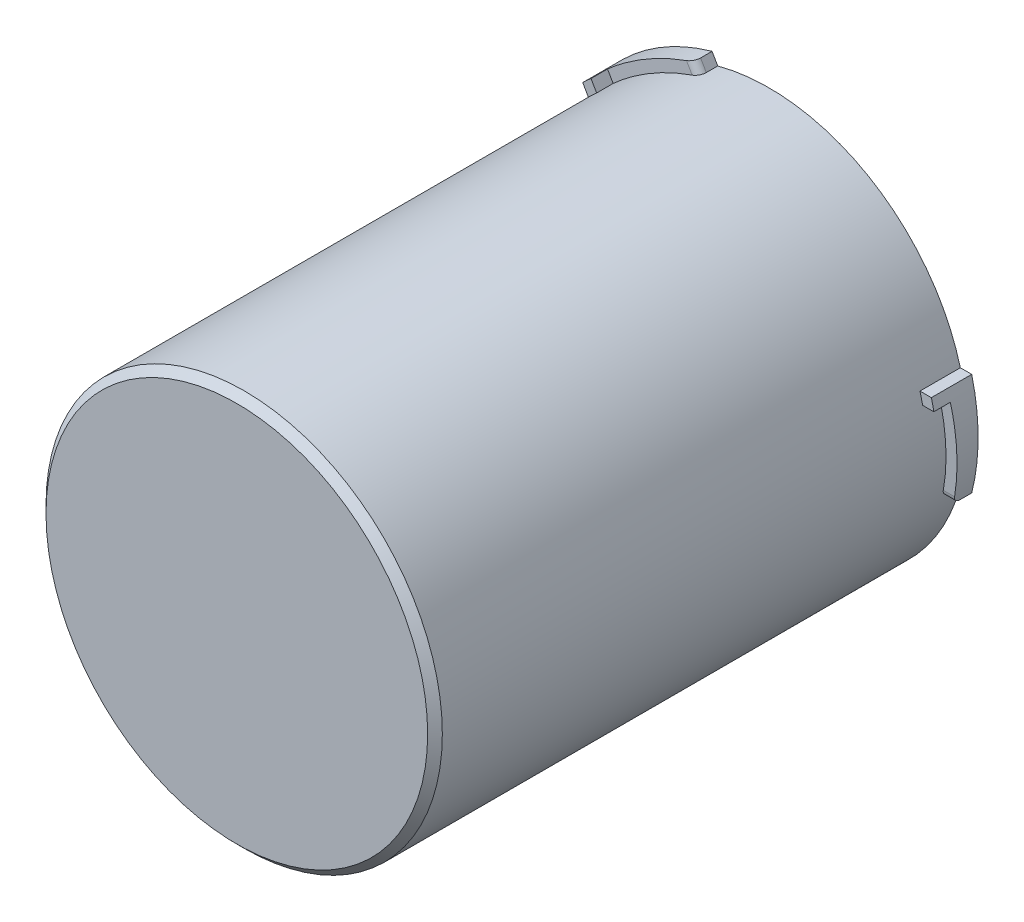
ISO-10303-21;
HEADER;
FILE_DESCRIPTION(('STEP AP214'),'2;1');
FILE_NAME('part.step','',(''),(''),'','','');
FILE_SCHEMA(('AUTOMOTIVE_DESIGN { 1 0 10303 214 1 1 1 1 }'));
ENDSEC;
DATA;
#1=APPLICATION_CONTEXT('core data for automotive mechanical design processes');
#2=APPLICATION_PROTOCOL_DEFINITION('international standard','automotive_design',2000,#1);
#3=PRODUCT_CONTEXT('',#1,'mechanical');
#4=PRODUCT('Part','Part','',(#3));
#5=PRODUCT_RELATED_PRODUCT_CATEGORY('part','',(#4));
#6=PRODUCT_DEFINITION_FORMATION('','',#4);
#7=PRODUCT_DEFINITION_CONTEXT('part definition',#1,'design');
#8=PRODUCT_DEFINITION('design','',#6,#7);
#9=PRODUCT_DEFINITION_SHAPE('','',#8);
#10=(LENGTH_UNIT() NAMED_UNIT(*) SI_UNIT(.MILLI.,.METRE.));
#11=(NAMED_UNIT(*) PLANE_ANGLE_UNIT() SI_UNIT($,.RADIAN.));
#12=(NAMED_UNIT(*) SI_UNIT($,.STERADIAN.) SOLID_ANGLE_UNIT());
#13=UNCERTAINTY_MEASURE_WITH_UNIT(LENGTH_MEASURE(1.E-05),#10,'distance_accuracy_value','');
#14=(GEOMETRIC_REPRESENTATION_CONTEXT(3) GLOBAL_UNCERTAINTY_ASSIGNED_CONTEXT((#13)) GLOBAL_UNIT_ASSIGNED_CONTEXT((#10,
#11,#12)) REPRESENTATION_CONTEXT('',''));
#15=CARTESIAN_POINT('',(0.,0.,0.));
#16=DIRECTION('',(0.,0.,1.));
#17=DIRECTION('',(1.,0.,0.));
#18=AXIS2_PLACEMENT_3D('',#15,#16,#17);
#19=CARTESIAN_POINT('',(-54.,0.,-145.));
#20=DIRECTION('',(0.,0.,-1.));
#21=DIRECTION('',(-1.,0.,0.));
#22=AXIS2_PLACEMENT_3D('',#19,#20,#21);
#23=PLANE('',#22);
#24=CARTESIAN_POINT('',(0.,0.,-145.));
#25=DIRECTION('',(0.,0.,-1.));
#26=DIRECTION('',(-1.,0.,0.));
#27=AXIS2_PLACEMENT_3D('',#24,#25,#26);
#28=CIRCLE('',#27,51.);
#29=CARTESIAN_POINT('',(-51.,0.,-145.));
#30=VERTEX_POINT('',#29);
#31=EDGE_CURVE('E295',#30,#30,#28,.T.);
#32=ORIENTED_EDGE('',*,*,#31,.F.);
#33=EDGE_LOOP('',(#32));
#34=FACE_BOUND('',#33,.T.);
#35=DIRECTION('',(-0.499999999999992,0.866025403784443,0.));
#36=VECTOR('',#35,1.);
#37=CARTESIAN_POINT('',(-35.6243556529818,33.7031939778689,-145.));
#38=LINE('',#37,#36);
#39=CARTESIAN_POINT('',(-38.2011652737924,38.1663591625452,-145.));
#40=VERTEX_POINT('',#39);
#41=CARTESIAN_POINT('',(-39.7513352200644,40.8513322698547,-145.));
#42=VERTEX_POINT('',#41);
#43=EDGE_CURVE('E200',#40,#42,#38,.T.);
#44=ORIENTED_EDGE('',*,*,#43,.T.);
#45=CARTESIAN_POINT('',(0.,0.,-145.));
#46=DIRECTION('',(0.,0.,-1.));
#47=DIRECTION('',(-1.,0.,0.));
#48=AXIS2_PLACEMENT_3D('',#45,#46,#47);
#49=CIRCLE('',#48,57.);
#50=CARTESIAN_POINT('',(-15.5026239141,54.8513322698545,-145.));
#51=VERTEX_POINT('',#50);
#52=EDGE_CURVE('E181',#42,#51,#49,.T.);
#53=ORIENTED_EDGE('',*,*,#52,.T.);
#54=DIRECTION('',(-0.499999999999992,0.866025403784443,0.));
#55=VECTOR('',#54,1.);
#56=CARTESIAN_POINT('',(-11.3756443470174,47.7031939778687,-145.));
#57=LINE('',#56,#55);
#58=CARTESIAN_POINT('',(-13.952453967828,52.166359162545,-145.));
#59=VERTEX_POINT('',#58);
#60=EDGE_CURVE('E211',#59,#51,#57,.T.);
#61=ORIENTED_EDGE('',*,*,#60,.F.);
#62=CARTESIAN_POINT('',(0.,0.,-145.));
#63=DIRECTION('',(0.,0.,-1.));
#64=DIRECTION('',(-1.,0.,0.));
#65=AXIS2_PLACEMENT_3D('',#62,#63,#64);
#66=CIRCLE('',#65,54.);
#67=CARTESIAN_POINT('',(52.1536192416212,14.,-145.));
#68=VERTEX_POINT('',#67);
#69=EDGE_CURVE('E298',#59,#68,#66,.T.);
#70=ORIENTED_EDGE('',*,*,#69,.T.);
#71=DIRECTION('',(1.,0.,0.));
#72=VECTOR('',#71,1.);
#73=CARTESIAN_POINT('',(47.,14.,-145.));
#74=LINE('',#73,#72);
#75=CARTESIAN_POINT('',(55.2539591341652,14.,-145.));
#76=VERTEX_POINT('',#75);
#77=EDGE_CURVE('E267',#68,#76,#74,.T.);
#78=ORIENTED_EDGE('',*,*,#77,.T.);
#79=CARTESIAN_POINT('',(55.2539591341652,-14.,-145.));
#80=VERTEX_POINT('',#79);
#81=EDGE_CURVE('E192',#76,#80,#49,.T.);
#82=ORIENTED_EDGE('',*,*,#81,.T.);
#83=DIRECTION('',(1.,0.,0.));
#84=VECTOR('',#83,1.);
#85=CARTESIAN_POINT('',(47.,-14.,-145.));
#86=LINE('',#85,#84);
#87=CARTESIAN_POINT('',(52.1536192416212,-14.,-145.));
#88=VERTEX_POINT('',#87);
#89=EDGE_CURVE('E271',#88,#80,#86,.T.);
#90=ORIENTED_EDGE('',*,*,#89,.F.);
#91=CARTESIAN_POINT('',(-13.9524539678287,-52.1663591625448,-145.));
#92=VERTEX_POINT('',#91);
#93=EDGE_CURVE('E299',#88,#92,#66,.T.);
#94=ORIENTED_EDGE('',*,*,#93,.T.);
#95=DIRECTION('',(-0.500000000000004,-0.866025403784436,0.));
#96=VECTOR('',#95,1.);
#97=CARTESIAN_POINT('',(-11.3756443470181,-47.7031939778686,-145.));
#98=LINE('',#97,#96);
#99=CARTESIAN_POINT('',(-15.5026239141007,-54.8513322698542,-145.));
#100=VERTEX_POINT('',#99);
#101=EDGE_CURVE('E238',#92,#100,#98,.T.);
#102=ORIENTED_EDGE('',*,*,#101,.T.);
#103=CARTESIAN_POINT('',(-39.7513352200649,-40.8513322698541,-145.));
#104=VERTEX_POINT('',#103);
#105=EDGE_CURVE('E194',#100,#104,#49,.T.);
#106=ORIENTED_EDGE('',*,*,#105,.T.);
#107=DIRECTION('',(-0.500000000000004,-0.866025403784436,0.));
#108=VECTOR('',#107,1.);
#109=CARTESIAN_POINT('',(-35.6243556529823,-33.7031939778685,-145.));
#110=LINE('',#109,#108);
#111=CARTESIAN_POINT('',(-38.2011652737929,-38.1663591625447,-145.));
#112=VERTEX_POINT('',#111);
#113=EDGE_CURVE('E242',#112,#104,#110,.T.);
#114=ORIENTED_EDGE('',*,*,#113,.F.);
#115=EDGE_CURVE('E209',#112,#40,#66,.T.);
#116=ORIENTED_EDGE('',*,*,#115,.T.);
#117=EDGE_LOOP('',(#44,#53,#61,#70,#78,#82,#90,#94,#102,#106,#114,#116));
#118=FACE_BOUND('',#117,.T.);
#119=ADVANCED_FACE('F39',(#34,#118),#23,.T.);
#120=CARTESIAN_POINT('',(47.,14.,-134.));
#121=DIRECTION('',(0.,1.,0.));
#122=DIRECTION('',(0.,0.,1.));
#123=AXIS2_PLACEMENT_3D('',#120,#121,#122);
#124=PLANE('',#123);
#125=DIRECTION('',(1.,0.,0.));
#126=VECTOR('',#125,1.);
#127=CARTESIAN_POINT('',(47.,14.,-134.));
#128=LINE('',#127,#126);
#129=CARTESIAN_POINT('',(52.1536192416212,14.,-134.));
#130=VERTEX_POINT('',#129);
#131=CARTESIAN_POINT('',(55.2539591341652,14.,-134.));
#132=VERTEX_POINT('',#131);
#133=EDGE_CURVE('E266',#130,#132,#128,.T.);
#134=ORIENTED_EDGE('',*,*,#133,.T.);
#135=DIRECTION('',(0.,0.,-1.));
#136=VECTOR('',#135,1.);
#137=CARTESIAN_POINT('',(55.2539591341652,14.,-130.));
#138=LINE('',#137,#136);
#139=EDGE_CURVE('E219',#132,#76,#138,.T.);
#140=ORIENTED_EDGE('',*,*,#139,.T.);
#141=ORIENTED_EDGE('',*,*,#77,.F.);
#142=DIRECTION('',(0.,0.,-1.));
#143=VECTOR('',#142,1.);
#144=CARTESIAN_POINT('',(52.1536192416212,14.,-2.99999999999999));
#145=LINE('',#144,#143);
#146=EDGE_CURVE('E292',#68,#130,#145,.F.);
#147=ORIENTED_EDGE('',*,*,#146,.T.);
#148=EDGE_LOOP('',(#134,#140,#141,#147));
#149=FACE_BOUND('',#148,.T.);
#150=ADVANCED_FACE('F410',(#149),#124,.T.);
#151=CARTESIAN_POINT('',(47.,-14.,-145.));
#152=DIRECTION('',(0.,-1.,0.));
#153=DIRECTION('',(0.,0.,-1.));
#154=AXIS2_PLACEMENT_3D('',#151,#152,#153);
#155=PLANE('',#154);
#156=ORIENTED_EDGE('',*,*,#89,.T.);
#157=DIRECTION('',(0.,0.,-1.));
#158=VECTOR('',#157,1.);
#159=CARTESIAN_POINT('',(55.2539591341652,-14.,-130.));
#160=LINE('',#159,#158);
#161=CARTESIAN_POINT('',(55.2539591341652,-14.,-141.883596765819));
#162=VERTEX_POINT('',#161);
#163=EDGE_CURVE('E388',#80,#162,#160,.F.);
#164=ORIENTED_EDGE('',*,*,#163,.T.);
#165=DIRECTION('',(1.,0.,0.));
#166=VECTOR('',#165,1.);
#167=CARTESIAN_POINT('',(47.,-14.,-141.883596765819));
#168=LINE('',#167,#166);
#169=CARTESIAN_POINT('',(52.1536192416212,-14.,-141.883596765819));
#170=VERTEX_POINT('',#169);
#171=EDGE_CURVE('E305',#162,#170,#168,.F.);
#172=ORIENTED_EDGE('',*,*,#171,.T.);
#173=DIRECTION('',(0.,0.,-1.));
#174=VECTOR('',#173,1.);
#175=CARTESIAN_POINT('',(52.1536192416212,-14.,-2.99999999999999));
#176=LINE('',#175,#174);
#177=EDGE_CURVE('E290',#170,#88,#176,.T.);
#178=ORIENTED_EDGE('',*,*,#177,.T.);
#179=EDGE_LOOP('',(#156,#164,#172,#178));
#180=FACE_BOUND('',#179,.T.);
#181=ADVANCED_FACE('F484',(#180),#155,.T.);
#182=CARTESIAN_POINT('',(47.,-14.,-140.));
#183=DIRECTION('',(0.,-0.0598922907279468,0.998204845465779));
#184=DIRECTION('',(0.,-0.998204845465779,-0.0598922907279468));
#185=AXIS2_PLACEMENT_3D('',#182,#183,#184);
#186=PLANE('',#185);
#187=DIRECTION('',(1.,0.,0.));
#188=VECTOR('',#187,1.);
#189=CARTESIAN_POINT('',(47.,-12.1197845814559,-139.887187074887));
#190=LINE('',#189,#188);
#191=CARTESIAN_POINT('',(52.6223414691812,-12.1197845814559,-139.887187074887));
#192=VERTEX_POINT('',#191);
#193=CARTESIAN_POINT('',(55.6965961410489,-12.1197845814559,-139.887187074887));
#194=VERTEX_POINT('',#193);
#195=EDGE_CURVE('E302',#192,#194,#190,.T.);
#196=ORIENTED_EDGE('',*,*,#195,.T.);
#197=CARTESIAN_POINT('',(0.,0.,-139.16));
#198=DIRECTION('',(0.,-0.0598922907279468,0.998204845465779));
#199=DIRECTION('',(0.,-0.998204845465779,-0.0598922907279468));
#200=AXIS2_PLACEMENT_3D('',#197,#198,#199);
#201=ELLIPSE('',#200,57.102507825839,57.);
#202=CARTESIAN_POINT('',(55.9285258164383,11.,-138.5));
#203=VERTEX_POINT('',#202);
#204=EDGE_CURVE('E54',#194,#203,#201,.T.);
#205=ORIENTED_EDGE('',*,*,#204,.T.);
#206=DIRECTION('',(1.,0.,0.));
#207=VECTOR('',#206,1.);
#208=CARTESIAN_POINT('',(47.,11.,-138.5));
#209=LINE('',#208,#207);
#210=CARTESIAN_POINT('',(52.8677595515452,10.9999999999999,-138.5));
#211=VERTEX_POINT('',#210);
#212=EDGE_CURVE('E274',#211,#203,#209,.T.);
#213=ORIENTED_EDGE('',*,*,#212,.F.);
#214=CARTESIAN_POINT('',(0.,0.,-139.16));
#215=DIRECTION('',(0.,-0.0598922907279468,0.998204845465779));
#216=DIRECTION('',(0.,-0.998204845465779,-0.0598922907279468));
#217=AXIS2_PLACEMENT_3D('',#214,#215,#216);
#218=ELLIPSE('',#217,54.0971126771106,54.);
#219=EDGE_CURVE('E287',#211,#192,#218,.F.);
#220=ORIENTED_EDGE('',*,*,#219,.T.);
#221=EDGE_LOOP('',(#196,#205,#213,#220));
#222=FACE_BOUND('',#221,.T.);
#223=ADVANCED_FACE('F501',(#222),#186,.T.);
#224=CARTESIAN_POINT('',(47.,11.,-138.5));
#225=DIRECTION('',(0.,-1.,0.));
#226=DIRECTION('',(0.,0.,-1.));
#227=AXIS2_PLACEMENT_3D('',#224,#225,#226);
#228=PLANE('',#227);
#229=ORIENTED_EDGE('',*,*,#212,.T.);
#230=DIRECTION('',(0.,0.,-1.));
#231=VECTOR('',#230,1.);
#232=CARTESIAN_POINT('',(55.9285258164383,11.,-130.));
#233=LINE('',#232,#231);
#234=CARTESIAN_POINT('',(55.9285258164383,11.,-134.));
#235=VERTEX_POINT('',#234);
#236=EDGE_CURVE('E392',#203,#235,#233,.F.);
#237=ORIENTED_EDGE('',*,*,#236,.T.);
#238=DIRECTION('',(1.,0.,0.));
#239=VECTOR('',#238,1.);
#240=CARTESIAN_POINT('',(47.,11.,-134.));
#241=LINE('',#240,#239);
#242=CARTESIAN_POINT('',(52.8677595515452,11.,-134.));
#243=VERTEX_POINT('',#242);
#244=EDGE_CURVE('E277',#243,#235,#241,.T.);
#245=ORIENTED_EDGE('',*,*,#244,.F.);
#246=DIRECTION('',(0.,0.,-1.));
#247=VECTOR('',#246,1.);
#248=CARTESIAN_POINT('',(52.8677595515452,10.9999999999999,-2.99999999999999));
#249=LINE('',#248,#247);
#250=EDGE_CURVE('E284',#243,#211,#249,.T.);
#251=ORIENTED_EDGE('',*,*,#250,.T.);
#252=EDGE_LOOP('',(#229,#237,#245,#251));
#253=FACE_BOUND('',#252,.T.);
#254=ADVANCED_FACE('F400',(#253),#228,.T.);
#255=CARTESIAN_POINT('',(47.,11.,-134.));
#256=DIRECTION('',(0.,0.,1.));
#257=DIRECTION('',(1.,0.,0.));
#258=AXIS2_PLACEMENT_3D('',#255,#256,#257);
#259=PLANE('',#258);
#260=ORIENTED_EDGE('',*,*,#244,.T.);
#261=CARTESIAN_POINT('',(0.,0.,-134.));
#262=DIRECTION('',(0.,0.,1.));
#263=DIRECTION('',(1.,0.,0.));
#264=AXIS2_PLACEMENT_3D('',#261,#262,#263);
#265=CIRCLE('',#264,57.);
#266=EDGE_CURVE('E395',#235,#132,#265,.T.);
#267=ORIENTED_EDGE('',*,*,#266,.T.);
#268=ORIENTED_EDGE('',*,*,#133,.F.);
#269=CARTESIAN_POINT('',(0.,0.,-134.));
#270=DIRECTION('',(0.,0.,1.));
#271=DIRECTION('',(1.,0.,0.));
#272=AXIS2_PLACEMENT_3D('',#269,#270,#271);
#273=CIRCLE('',#272,54.);
#274=EDGE_CURVE('E270',#130,#243,#273,.F.);
#275=ORIENTED_EDGE('',*,*,#274,.T.);
#276=EDGE_LOOP('',(#260,#267,#268,#275));
#277=FACE_BOUND('',#276,.T.);
#278=ADVANCED_FACE('F403',(#277),#259,.T.);
#279=CARTESIAN_POINT('',(47.,-12.,-141.883596765819));
#280=DIRECTION('',(1.,0.,0.));
#281=DIRECTION('',(0.,0.,-1.));
#282=AXIS2_PLACEMENT_3D('',#279,#280,#281);
#283=CYLINDRICAL_SURFACE('',#282,2.);
#284=ORIENTED_EDGE('',*,*,#171,.F.);
#285=CARTESIAN_POINT('',(55.2539591341652,-14.,-141.883596765819));
#286=CARTESIAN_POINT('',(55.2539585125054,-14.0000005367194,-141.828523752097));
#287=CARTESIAN_POINT('',(55.2545359383956,-13.9977237283669,-141.773477634569));
#288=CARTESIAN_POINT('',(55.256834841071,-13.9886466767112,-141.663790158488));
#289=CARTESIAN_POINT('',(55.258556183353,-13.9818469652169,-141.609148753112));
#290=CARTESIAN_POINT('',(55.2654066347746,-13.9547553891467,-141.446613532741));
#291=CARTESIAN_POINT('',(55.2722223012515,-13.9277707139644,-141.339826121369));
#292=CARTESIAN_POINT('',(55.2900482512312,-13.8568352806215,-141.13247070724));
#293=CARTESIAN_POINT('',(55.3010591486179,-13.8128820394553,-141.0319036172));
#294=CARTESIAN_POINT('',(55.3268019748571,-13.7094060836742,-140.839640585733));
#295=CARTESIAN_POINT('',(55.3415341361408,-13.6498823965163,-140.74794519893));
#296=CARTESIAN_POINT('',(55.3743582345525,-13.5161106300099,-140.574562123407));
#297=CARTESIAN_POINT('',(55.3924951314453,-13.4416644849191,-140.493035984245));
#298=CARTESIAN_POINT('',(55.4312966401882,-13.2807451622867,-140.343545714561));
#299=CARTESIAN_POINT('',(55.4519621934757,-13.1942675036721,-140.275586660097));
#300=CARTESIAN_POINT('',(55.4957013876148,-13.0090901553543,-140.153160374182));
#301=CARTESIAN_POINT('',(55.518826869443,-12.9101124025027,-140.099132804047));
#302=CARTESIAN_POINT('',(55.5661779443691,-12.7047603394677,-140.008527143711));
#303=CARTESIAN_POINT('',(55.5904027393309,-12.5983913666549,-139.971936608825));
#304=CARTESIAN_POINT('',(55.6284079350701,-12.4291640094491,-139.929179878513));
#305=CARTESIAN_POINT('',(55.6420827192817,-12.3678057292128,-139.91671276943));
#306=CARTESIAN_POINT('',(55.6693916711392,-12.2442983859839,-139.897592125891));
#307=CARTESIAN_POINT('',(55.6830258677354,-12.1821509274881,-139.890928268508));
#308=CARTESIAN_POINT('',(55.6965961410489,-12.1197845814559,-139.887187074887));
#309=B_SPLINE_CURVE_WITH_KNOTS('',3,(#285,#286,#287,#288,#289,#290,#291,#292,#293,#294,#295,
#296,#297,#298,#299,#300,#301,#302,#303,#304,#305,#306,#307,#308),.UNSPECIFIED.,.F.,.F.,(4,2,2,
2,2,2,2,2,2,2,2,4),(0.,0.165115829650282,0.330212248197019,0.659568276928968,0.988972518515699,
1.3183973398773,1.65252481489193,1.98677706870723,2.33055444574179,2.67408610256854,
2.86610985522351,3.05779133078798),.UNSPECIFIED.);
#310=EDGE_CURVE('E381',#162,#194,#309,.T.);
#311=ORIENTED_EDGE('',*,*,#310,.T.);
#312=ORIENTED_EDGE('',*,*,#195,.F.);
#313=CARTESIAN_POINT('',(52.1536192416212,-14.,-141.883596765819));
#314=CARTESIAN_POINT('',(52.1536185568167,-14.000000638517,-141.828662060855));
#315=CARTESIAN_POINT('',(52.1542272711735,-13.9977351396233,-141.773754247999));
#316=CARTESIAN_POINT('',(52.1566505453299,-13.9887038828323,-141.664343674894));
#317=CARTESIAN_POINT('',(52.158464953455,-13.9819386909891,-141.609840864568));
#318=CARTESIAN_POINT('',(52.1656848064175,-13.9549882075101,-141.447731525654));
#319=CARTESIAN_POINT('',(52.1728670286606,-13.9281476143837,-141.341230667811));
#320=CARTESIAN_POINT('',(52.1916461762234,-13.8576110310764,-141.134439932355));
#321=CARTESIAN_POINT('',(52.2032435734467,-13.813913239154,-141.034150719988));
#322=CARTESIAN_POINT('',(52.2303500158355,-13.7110668756349,-140.842403980467));
#323=CARTESIAN_POINT('',(52.245859428544,-13.6519168522463,-140.750947284266));
#324=CARTESIAN_POINT('',(52.2804344282289,-13.5189111311201,-140.577834270253));
#325=CARTESIAN_POINT('',(52.2995526191321,-13.4448366435394,-140.496356823663));
#326=CARTESIAN_POINT('',(52.3404491882954,-13.2847354020005,-140.346894771056));
#327=CARTESIAN_POINT('',(52.3622285676468,-13.1987041484386,-140.278915268124));
#328=CARTESIAN_POINT('',(52.40839878766,-13.0141868009322,-140.156142920303));
#329=CARTESIAN_POINT('',(52.4328506404641,-12.9153916877053,-140.101838038407));
#330=CARTESIAN_POINT('',(52.4829233339157,-12.710383840538,-140.010652502082));
#331=CARTESIAN_POINT('',(52.5085433737358,-12.6041761623991,-139.973760102094));
#332=CARTESIAN_POINT('',(52.5489871949959,-12.4341455626784,-139.930247501891));
#333=CARTESIAN_POINT('',(52.5636978622072,-12.371814966283,-139.917434127239));
#334=CARTESIAN_POINT('',(52.5930762727059,-12.2463257733772,-139.897810259443));
#335=CARTESIAN_POINT('',(52.6077440457752,-12.1831688496745,-139.890989113374));
#336=CARTESIAN_POINT('',(52.6223414691812,-12.1197845814559,-139.887187074887));
#337=B_SPLINE_CURVE_WITH_KNOTS('',3,(#313,#314,#315,#316,#317,#318,#319,#320,#321,#322,#323,
#324,#325,#326,#327,#328,#329,#330,#331,#332,#333,#334,#335,#336),.UNSPECIFIED.,.F.,.F.,(4,2,2,
2,2,2,2,2,2,2,2,4),(0.,0.164700948774083,0.329381182352863,0.65787279650389,0.986399530428337,
1.31495714171092,1.64873685506211,1.98264251916462,2.32716416508593,2.67145308123225,
2.8671373137039,3.0624729525344),.UNSPECIFIED.);
#338=EDGE_CURVE('E307',#170,#192,#337,.T.);
#339=ORIENTED_EDGE('',*,*,#338,.F.);
#340=EDGE_LOOP('',(#284,#311,#312,#339));
#341=FACE_BOUND('',#340,.T.);
#342=ADVANCED_FACE('F317',(#341),#283,.T.);
#343=CARTESIAN_POINT('',(-11.3756443470181,-47.7031939778686,-134.));
#344=DIRECTION('',(0.866025403784436,-0.500000000000004,0.));
#345=DIRECTION('',(0.500000000000004,0.866025403784436,0.));
#346=AXIS2_PLACEMENT_3D('',#343,#344,#345);
#347=PLANE('',#346);
#348=DIRECTION('',(-0.500000000000004,-0.866025403784436,0.));
#349=VECTOR('',#348,1.);
#350=CARTESIAN_POINT('',(-11.3756443470181,-47.7031939778686,-134.));
#351=LINE('',#350,#349);
#352=CARTESIAN_POINT('',(-13.9524539678287,-52.1663591625448,-134.));
#353=VERTEX_POINT('',#352);
#354=CARTESIAN_POINT('',(-15.5026239141007,-54.8513322698542,-134.));
#355=VERTEX_POINT('',#354);
#356=EDGE_CURVE('E237',#353,#355,#351,.T.);
#357=ORIENTED_EDGE('',*,*,#356,.T.);
#358=DIRECTION('',(0.,0.,-1.));
#359=VECTOR('',#358,1.);
#360=CARTESIAN_POINT('',(-15.5026239141007,-54.8513322698542,-130.));
#361=LINE('',#360,#359);
#362=EDGE_CURVE('E389',#355,#100,#361,.T.);
#363=ORIENTED_EDGE('',*,*,#362,.T.);
#364=ORIENTED_EDGE('',*,*,#101,.F.);
#365=DIRECTION('',(0.,0.,-1.));
#366=VECTOR('',#365,1.);
#367=CARTESIAN_POINT('',(-13.9524539678287,-52.1663591625448,-3.));
#368=LINE('',#367,#366);
#369=EDGE_CURVE('E263',#92,#353,#368,.F.);
#370=ORIENTED_EDGE('',*,*,#369,.T.);
#371=EDGE_LOOP('',(#357,#363,#364,#370));
#372=FACE_BOUND('',#371,.T.);
#373=ADVANCED_FACE('F463',(#372),#347,.T.);
#374=CARTESIAN_POINT('',(-35.6243556529823,-33.7031939778685,-145.));
#375=DIRECTION('',(-0.866025403784436,0.500000000000004,0.));
#376=DIRECTION('',(-0.500000000000004,-0.866025403784436,0.));
#377=AXIS2_PLACEMENT_3D('',#374,#375,#376);
#378=PLANE('',#377);
#379=ORIENTED_EDGE('',*,*,#113,.T.);
#380=DIRECTION('',(0.,0.,-1.));
#381=VECTOR('',#380,1.);
#382=CARTESIAN_POINT('',(-39.7513352200649,-40.8513322698541,-130.));
#383=LINE('',#382,#381);
#384=CARTESIAN_POINT('',(-39.7513352200649,-40.8513322698541,-141.883596765819));
#385=VERTEX_POINT('',#384);
#386=EDGE_CURVE('E360',#104,#385,#383,.F.);
#387=ORIENTED_EDGE('',*,*,#386,.T.);
#388=DIRECTION('',(-0.500000000000004,-0.866025403784436,0.));
#389=VECTOR('',#388,1.);
#390=CARTESIAN_POINT('',(-35.6243556529823,-33.7031939778685,-141.883596765819));
#391=LINE('',#390,#389);
#392=CARTESIAN_POINT('',(-38.2011652737929,-38.1663591625447,-141.883596765819));
#393=VERTEX_POINT('',#392);
#394=EDGE_CURVE('E340',#385,#393,#391,.F.);
#395=ORIENTED_EDGE('',*,*,#394,.T.);
#396=DIRECTION('',(0.,0.,-1.));
#397=VECTOR('',#396,1.);
#398=CARTESIAN_POINT('',(-38.2011652737929,-38.1663591625447,-3.));
#399=LINE('',#398,#397);
#400=EDGE_CURVE('E261',#393,#112,#399,.T.);
#401=ORIENTED_EDGE('',*,*,#400,.T.);
#402=EDGE_LOOP('',(#379,#387,#395,#401));
#403=FACE_BOUND('',#402,.T.);
#404=ADVANCED_FACE('F445',(#403),#378,.T.);
#405=CARTESIAN_POINT('',(-35.6243556529823,-33.7031939778685,-140.));
#406=DIRECTION('',(-0.0518682452612451,0.0299461453639736,0.998204845465779));
#407=DIRECTION('',(0.998652727613559,0.,0.0518915179003178));
#408=AXIS2_PLACEMENT_3D('',#405,#406,#407);
#409=PLANE('',#408);
#410=DIRECTION('',(-0.500000000000004,-0.866025403784436,0.));
#411=VECTOR('',#410,1.);
#412=CARTESIAN_POINT('',(-33.9960413359359,-34.6433016871405,-139.887187074887));
#413=LINE('',#412,#411);
#414=CARTESIAN_POINT('',(-36.8072120705265,-39.5123922282021,-139.887187074887));
#415=VERTEX_POINT('',#414);
#416=CARTESIAN_POINT('',(-38.3443394064604,-42.1747748717426,-139.887187074887));
#417=VERTEX_POINT('',#416);
#418=EDGE_CURVE('E315',#415,#417,#413,.T.);
#419=ORIENTED_EDGE('',*,*,#418,.T.);
#420=CARTESIAN_POINT('',(0.,0.,-139.16));
#421=DIRECTION('',(-0.0518682452612451,0.0299461453639736,0.998204845465779));
#422=DIRECTION('',(-0.864470754354082,0.499102422732892,-0.0598922907279468));
#423=AXIS2_PLACEMENT_3D('',#420,#421,#422);
#424=ELLIPSE('',#423,57.102507825839,57.);
#425=CARTESIAN_POINT('',(-18.4379834665905,-53.9355241532492,-138.5));
#426=VERTEX_POINT('',#425);
#427=EDGE_CURVE('E62',#417,#426,#424,.T.);
#428=ORIENTED_EDGE('',*,*,#427,.T.);
#429=DIRECTION('',(-0.500000000000004,-0.866025403784436,0.));
#430=VECTOR('',#429,1.);
#431=CARTESIAN_POINT('',(-13.9737205583714,-46.2031939778686,-138.5));
#432=LINE('',#431,#430);
#433=CARTESIAN_POINT('',(-16.9076003341441,-51.2848228128055,-138.5));
#434=VERTEX_POINT('',#433);
#435=EDGE_CURVE('E245',#434,#426,#432,.T.);
#436=ORIENTED_EDGE('',*,*,#435,.F.);
#437=CARTESIAN_POINT('',(0.,0.,-139.16));
#438=DIRECTION('',(-0.0518682452612451,0.0299461453639736,0.998204845465779));
#439=DIRECTION('',(-0.864470754354082,0.499102422732892,-0.0598922907279468));
#440=AXIS2_PLACEMENT_3D('',#437,#438,#439);
#441=ELLIPSE('',#440,54.0971126771106,54.);
#442=EDGE_CURVE('E258',#434,#415,#441,.F.);
#443=ORIENTED_EDGE('',*,*,#442,.T.);
#444=EDGE_LOOP('',(#419,#428,#436,#443));
#445=FACE_BOUND('',#444,.T.);
#446=ADVANCED_FACE('F450',(#445),#409,.T.);
#447=CARTESIAN_POINT('',(-13.9737205583714,-46.2031939778686,-138.5));
#448=DIRECTION('',(-0.866025403784436,0.500000000000004,0.));
#449=DIRECTION('',(-0.500000000000004,-0.866025403784436,0.));
#450=AXIS2_PLACEMENT_3D('',#447,#448,#449);
#451=PLANE('',#450);
#452=ORIENTED_EDGE('',*,*,#435,.T.);
#453=DIRECTION('',(0.,0.,-1.));
#454=VECTOR('',#453,1.);
#455=CARTESIAN_POINT('',(-18.4379834665905,-53.9355241532492,-130.));
#456=LINE('',#455,#454);
#457=CARTESIAN_POINT('',(-18.4379834665905,-53.9355241532492,-134.));
#458=VERTEX_POINT('',#457);
#459=EDGE_CURVE('E457',#426,#458,#456,.F.);
#460=ORIENTED_EDGE('',*,*,#459,.T.);
#461=DIRECTION('',(-0.500000000000004,-0.866025403784436,0.));
#462=VECTOR('',#461,1.);
#463=CARTESIAN_POINT('',(-13.9737205583714,-46.2031939778686,-134.));
#464=LINE('',#463,#462);
#465=CARTESIAN_POINT('',(-16.907600334144,-51.2848228128055,-134.));
#466=VERTEX_POINT('',#465);
#467=EDGE_CURVE('E248',#466,#458,#464,.T.);
#468=ORIENTED_EDGE('',*,*,#467,.F.);
#469=DIRECTION('',(0.,0.,-1.));
#470=VECTOR('',#469,1.);
#471=CARTESIAN_POINT('',(-16.9076003341441,-51.2848228128055,-2.99999999999999));
#472=LINE('',#471,#470);
#473=EDGE_CURVE('E255',#466,#434,#472,.T.);
#474=ORIENTED_EDGE('',*,*,#473,.T.);
#475=EDGE_LOOP('',(#452,#460,#468,#474));
#476=FACE_BOUND('',#475,.T.);
#477=ADVANCED_FACE('F470',(#476),#451,.T.);
#478=CARTESIAN_POINT('',(-13.9737205583714,-46.2031939778686,-134.));
#479=DIRECTION('',(0.,0.,1.));
#480=DIRECTION('',(1.,0.,0.));
#481=AXIS2_PLACEMENT_3D('',#478,#479,#480);
#482=PLANE('',#481);
#483=ORIENTED_EDGE('',*,*,#467,.T.);
#484=CARTESIAN_POINT('',(0.,0.,-134.));
#485=DIRECTION('',(0.,0.,1.));
#486=DIRECTION('',(1.,0.,0.));
#487=AXIS2_PLACEMENT_3D('',#484,#485,#486);
#488=CIRCLE('',#487,57.);
#489=EDGE_CURVE('E203',#458,#355,#488,.T.);
#490=ORIENTED_EDGE('',*,*,#489,.T.);
#491=ORIENTED_EDGE('',*,*,#356,.F.);
#492=CARTESIAN_POINT('',(0.,0.,-134.));
#493=DIRECTION('',(0.,0.,1.));
#494=DIRECTION('',(1.,0.,0.));
#495=AXIS2_PLACEMENT_3D('',#492,#493,#494);
#496=CIRCLE('',#495,54.);
#497=EDGE_CURVE('E241',#353,#466,#496,.F.);
#498=ORIENTED_EDGE('',*,*,#497,.T.);
#499=EDGE_LOOP('',(#483,#490,#491,#498));
#500=FACE_BOUND('',#499,.T.);
#501=ADVANCED_FACE('F469',(#500),#482,.T.);
#502=CARTESIAN_POINT('',(-35.6243556529818,33.7031939778689,-134.));
#503=DIRECTION('',(-0.866025403784443,-0.499999999999992,0.));
#504=DIRECTION('',(0.499999999999992,-0.866025403784443,0.));
#505=AXIS2_PLACEMENT_3D('',#502,#503,#504);
#506=PLANE('',#505);
#507=DIRECTION('',(-0.499999999999992,0.866025403784443,0.));
#508=VECTOR('',#507,1.);
#509=CARTESIAN_POINT('',(-35.6243556529818,33.7031939778689,-134.));
#510=LINE('',#509,#508);
#511=CARTESIAN_POINT('',(-38.2011652737924,38.1663591625452,-134.));
#512=VERTEX_POINT('',#511);
#513=CARTESIAN_POINT('',(-39.7513352200644,40.8513322698547,-134.));
#514=VERTEX_POINT('',#513);
#515=EDGE_CURVE('E202',#512,#514,#510,.T.);
#516=ORIENTED_EDGE('',*,*,#515,.T.);
#517=DIRECTION('',(0.,0.,-1.));
#518=VECTOR('',#517,1.);
#519=CARTESIAN_POINT('',(-39.7513352200644,40.8513322698547,-130.));
#520=LINE('',#519,#518);
#521=EDGE_CURVE('E184',#514,#42,#520,.T.);
#522=ORIENTED_EDGE('',*,*,#521,.T.);
#523=ORIENTED_EDGE('',*,*,#43,.F.);
#524=DIRECTION('',(0.,0.,-1.));
#525=VECTOR('',#524,1.);
#526=CARTESIAN_POINT('',(-38.2011652737924,38.1663591625452,-3.));
#527=LINE('',#526,#525);
#528=EDGE_CURVE('E235',#40,#512,#527,.F.);
#529=ORIENTED_EDGE('',*,*,#528,.T.);
#530=EDGE_LOOP('',(#516,#522,#523,#529));
#531=FACE_BOUND('',#530,.T.);
#532=ADVANCED_FACE('F198',(#531),#506,.T.);
#533=CARTESIAN_POINT('',(-11.3756443470174,47.7031939778687,-145.));
#534=DIRECTION('',(0.866025403784443,0.499999999999992,0.));
#535=DIRECTION('',(-0.499999999999992,0.866025403784443,0.));
#536=AXIS2_PLACEMENT_3D('',#533,#534,#535);
#537=PLANE('',#536);
#538=ORIENTED_EDGE('',*,*,#60,.T.);
#539=DIRECTION('',(0.,0.,-1.));
#540=VECTOR('',#539,1.);
#541=CARTESIAN_POINT('',(-15.5026239141,54.8513322698544,-130.));
#542=LINE('',#541,#540);
#543=CARTESIAN_POINT('',(-15.5026239141,54.8513322698545,-141.883596765819));
#544=VERTEX_POINT('',#543);
#545=EDGE_CURVE('E187',#51,#544,#542,.F.);
#546=ORIENTED_EDGE('',*,*,#545,.T.);
#547=DIRECTION('',(-0.499999999999992,0.866025403784443,0.));
#548=VECTOR('',#547,1.);
#549=CARTESIAN_POINT('',(-11.3756443470174,47.7031939778687,-141.883596765819));
#550=LINE('',#549,#548);
#551=CARTESIAN_POINT('',(-13.952453967828,52.166359162545,-141.883596765819));
#552=VERTEX_POINT('',#551);
#553=EDGE_CURVE('E422',#544,#552,#550,.F.);
#554=ORIENTED_EDGE('',*,*,#553,.T.);
#555=DIRECTION('',(0.,0.,-1.));
#556=VECTOR('',#555,1.);
#557=CARTESIAN_POINT('',(-13.952453967828,52.166359162545,-3.));
#558=LINE('',#557,#556);
#559=EDGE_CURVE('E233',#552,#59,#558,.T.);
#560=ORIENTED_EDGE('',*,*,#559,.T.);
#561=EDGE_LOOP('',(#538,#546,#554,#560));
#562=FACE_BOUND('',#561,.T.);
#563=ADVANCED_FACE('F369',(#562),#537,.T.);
#564=CARTESIAN_POINT('',(-11.3756443470174,47.7031939778687,-140.));
#565=DIRECTION('',(0.0518682452612452,0.029946145363973,0.998204845465779));
#566=DIRECTION('',(0.998652727613559,0.,-0.051891517900318));
#567=AXIS2_PLACEMENT_3D('',#564,#565,#566);
#568=PLANE('',#567);
#569=DIRECTION('',(-0.499999999999992,0.866025403784443,0.));
#570=VECTOR('',#569,1.);
#571=CARTESIAN_POINT('',(-13.0039586640638,46.7630862685967,-139.887187074887));
#572=LINE('',#571,#570);
#573=CARTESIAN_POINT('',(-15.8151293986544,51.6321768096583,-139.887187074887));
#574=VERTEX_POINT('',#573);
#575=CARTESIAN_POINT('',(-17.3522567345882,54.2945594531988,-139.887187074887));
#576=VERTEX_POINT('',#575);
#577=EDGE_CURVE('E339',#574,#576,#572,.T.);
#578=ORIENTED_EDGE('',*,*,#577,.T.);
#579=CARTESIAN_POINT('',(0.,0.,-139.16));
#580=DIRECTION('',(0.0518682452612452,0.029946145363973,0.998204845465779));
#581=DIRECTION('',(0.864470754354088,0.499102422732882,-0.0598922907279467));
#582=AXIS2_PLACEMENT_3D('',#579,#580,#581);
#583=ELLIPSE('',#582,57.102507825839,57.);
#584=CARTESIAN_POINT('',(-37.4905423498475,42.9355241532497,-138.5));
#585=VERTEX_POINT('',#584);
#586=EDGE_CURVE('E204',#576,#585,#583,.T.);
#587=ORIENTED_EDGE('',*,*,#586,.T.);
#588=DIRECTION('',(-0.499999999999992,0.866025403784443,0.));
#589=VECTOR('',#588,1.);
#590=CARTESIAN_POINT('',(-33.0262794416285,35.2031939778689,-138.5));
#591=LINE('',#590,#589);
#592=CARTESIAN_POINT('',(-35.960159217401,40.2848228128059,-138.5));
#593=VERTEX_POINT('',#592);
#594=EDGE_CURVE('E216',#593,#585,#591,.T.);
#595=ORIENTED_EDGE('',*,*,#594,.F.);
#596=CARTESIAN_POINT('',(0.,0.,-139.16));
#597=DIRECTION('',(0.0518682452612452,0.029946145363973,0.998204845465779));
#598=DIRECTION('',(0.864470754354088,0.499102422732882,-0.0598922907279467));
#599=AXIS2_PLACEMENT_3D('',#596,#597,#598);
#600=ELLIPSE('',#599,54.0971126771106,54.);
#601=EDGE_CURVE('E230',#593,#574,#600,.F.);
#602=ORIENTED_EDGE('',*,*,#601,.T.);
#603=EDGE_LOOP('',(#578,#587,#595,#602));
#604=FACE_BOUND('',#603,.T.);
#605=ADVANCED_FACE('F431',(#604),#568,.T.);
#606=CARTESIAN_POINT('',(-33.0262794416285,35.2031939778689,-138.5));
#607=DIRECTION('',(0.866025403784443,0.499999999999992,0.));
#608=DIRECTION('',(-0.499999999999992,0.866025403784443,0.));
#609=AXIS2_PLACEMENT_3D('',#606,#607,#608);
#610=PLANE('',#609);
#611=ORIENTED_EDGE('',*,*,#594,.T.);
#612=DIRECTION('',(0.,0.,-1.));
#613=VECTOR('',#612,1.);
#614=CARTESIAN_POINT('',(-37.4905423498475,42.9355241532497,-130.));
#615=LINE('',#614,#613);
#616=CARTESIAN_POINT('',(-37.4905423498475,42.9355241532497,-134.));
#617=VERTEX_POINT('',#616);
#618=EDGE_CURVE('E437',#585,#617,#615,.F.);
#619=ORIENTED_EDGE('',*,*,#618,.T.);
#620=DIRECTION('',(-0.499999999999992,0.866025403784443,0.));
#621=VECTOR('',#620,1.);
#622=CARTESIAN_POINT('',(-33.0262794416285,35.2031939778689,-134.));
#623=LINE('',#622,#621);
#624=CARTESIAN_POINT('',(-35.9601592174011,40.2848228128059,-134.));
#625=VERTEX_POINT('',#624);
#626=EDGE_CURVE('E224',#625,#617,#623,.T.);
#627=ORIENTED_EDGE('',*,*,#626,.F.);
#628=DIRECTION('',(0.,0.,-1.));
#629=VECTOR('',#628,1.);
#630=CARTESIAN_POINT('',(-35.960159217401,40.2848228128059,-2.99999999999999));
#631=LINE('',#630,#629);
#632=EDGE_CURVE('E214',#625,#593,#631,.T.);
#633=ORIENTED_EDGE('',*,*,#632,.T.);
#634=EDGE_LOOP('',(#611,#619,#627,#633));
#635=FACE_BOUND('',#634,.T.);
#636=ADVANCED_FACE('F435',(#635),#610,.T.);
#637=CARTESIAN_POINT('',(-33.0262794416285,35.2031939778689,-134.));
#638=DIRECTION('',(0.,0.,1.));
#639=DIRECTION('',(1.,0.,0.));
#640=AXIS2_PLACEMENT_3D('',#637,#638,#639);
#641=PLANE('',#640);
#642=ORIENTED_EDGE('',*,*,#626,.T.);
#643=CARTESIAN_POINT('',(0.,0.,-134.));
#644=DIRECTION('',(0.,0.,1.));
#645=DIRECTION('',(1.,0.,0.));
#646=AXIS2_PLACEMENT_3D('',#643,#644,#645);
#647=CIRCLE('',#646,57.);
#648=EDGE_CURVE('E439',#617,#514,#647,.T.);
#649=ORIENTED_EDGE('',*,*,#648,.T.);
#650=ORIENTED_EDGE('',*,*,#515,.F.);
#651=CARTESIAN_POINT('',(0.,0.,-134.));
#652=DIRECTION('',(0.,0.,1.));
#653=DIRECTION('',(1.,0.,0.));
#654=AXIS2_PLACEMENT_3D('',#651,#652,#653);
#655=CIRCLE('',#654,54.);
#656=EDGE_CURVE('E210',#512,#625,#655,.F.);
#657=ORIENTED_EDGE('',*,*,#656,.T.);
#658=EDGE_LOOP('',(#642,#649,#650,#657));
#659=FACE_BOUND('',#658,.T.);
#660=ADVANCED_FACE('F347',(#659),#641,.T.);
#661=CARTESIAN_POINT('',(-33.8923048454134,-34.7031939778685,-141.883596765819));
#662=DIRECTION('',(-0.500000000000004,-0.866025403784436,0.));
#663=DIRECTION('',(0.866025403784436,-0.500000000000004,0.));
#664=AXIS2_PLACEMENT_3D('',#661,#662,#663);
#665=CYLINDRICAL_SURFACE('',#664,2.);
#666=ORIENTED_EDGE('',*,*,#394,.F.);
#667=CARTESIAN_POINT('',(-39.7513352200649,-40.8513322698541,-141.883596765819));
#668=CARTESIAN_POINT('',(-39.7513353740477,-40.8513314631212,-141.828523752097));
#669=CARTESIAN_POINT('',(-39.7496523131199,-40.8529699327872,-141.773477634569));
#670=CARTESIAN_POINT('',(-39.7429408071323,-40.8594993667327,-141.663790158488));
#671=CARTESIAN_POINT('',(-39.7379127553809,-40.8643899486247,-141.609148753112));
#672=CARTESIAN_POINT('',(-39.7178759879863,-40.8838684016183,-141.446613532741));
#673=CARTESIAN_POINT('',(-39.697914407004,-40.9032632795222,-141.339826121369));
#674=CARTESIAN_POINT('',(-39.6453954946904,-40.9541687217227,-141.13247070724));
#675=CARTESIAN_POINT('',(-39.6128363199552,-40.9856810591611,-141.0319036172));
#676=CARTESIAN_POINT('',(-39.5360949266875,-41.05971297854,-140.839640585733));
#677=CARTESIAN_POINT('',(-39.4919119821237,-41.1022332480433,-140.74794519893));
#678=CARTESIAN_POINT('',(-39.3924742832259,-41.1975456343773,-140.574562123407));
#679=CARTESIAN_POINT('',(-39.3370704788098,-41.2504757203778,-140.493035984245));
#680=CARTESIAN_POINT('',(-39.2171110118218,-41.3645384739705,-140.343545714561));
#681=CARTESIAN_POINT('',(-39.1525519392455,-41.425674197408,-140.275586660097));
#682=CARTESIAN_POINT('',(-39.0140532484664,-41.5561421248324,-140.153160374182));
#683=CARTESIAN_POINT('',(-38.9398987410016,-41.6256582559962,-140.099132804047));
#684=CARTESIAN_POINT('',(-38.7857341751568,-41.7693415212962,-140.008527143711));
#685=CARTESIAN_POINT('',(-38.7057283400074,-41.843505295541,-139.971936608825));
#686=CARTESIAN_POINT('',(-38.5781757475214,-41.9610324391298,-139.929179878513));
#687=CARTESIAN_POINT('',(-38.53187531021,-42.0035542897665,-139.91671276943));
#688=CARTESIAN_POINT('',(-38.4385692893486,-42.0889582074403,-139.897592125891));
#689=CARTESIAN_POINT('',(-38.3915651098087,-42.1318394973006,-139.890928268508));
#690=CARTESIAN_POINT('',(-38.3443394064604,-42.1747748717426,-139.887187074887));
#691=B_SPLINE_CURVE_WITH_KNOTS('',3,(#667,#668,#669,#670,#671,#672,#673,#674,#675,#676,#677,
#678,#679,#680,#681,#682,#683,#684,#685,#686,#687,#688,#689,#690),.UNSPECIFIED.,.F.,.F.,(4,2,2,
2,2,2,2,2,2,2,2,4),(0.,0.165115829650282,0.330212248197019,0.659568276928968,0.988972518515697,
1.3183973398773,1.65252481489193,1.98677706870723,2.33055444574179,2.67408610256854,
2.86610985522352,3.05779133078798),.UNSPECIFIED.);
#692=EDGE_CURVE('E352',#385,#417,#691,.T.);
#693=ORIENTED_EDGE('',*,*,#692,.T.);
#694=ORIENTED_EDGE('',*,*,#418,.F.);
#695=CARTESIAN_POINT('',(-38.2011652737929,-38.1663591625447,-141.883596765819));
#696=CARTESIAN_POINT('',(-38.2011654843626,-38.1663582502281,-141.828662060855));
#697=CARTESIAN_POINT('',(-38.1995078619468,-38.1680181617716,-141.773754247999));
#698=CARTESIAN_POINT('',(-38.1928982012159,-38.1746324071468,-141.664343674894));
#699=CARTESIAN_POINT('',(-38.1879465772808,-38.1795863265976,-141.609840864568));
#700=CARTESIAN_POINT('',(-38.1682167004249,-38.1993141444142,-141.447731525654));
#701=CARTESIAN_POINT('',(-38.1485631760464,-38.2189544278956,-141.341230667811));
#702=CARTESIAN_POINT('',(-38.0968662767875,-38.2704859384,-141.134439932355));
#703=CARTESIAN_POINT('',(-38.0648215775051,-38.3023784749744,-141.034150719988));
#704=CARTESIAN_POINT('',(-37.9893072352051,-38.3772765244489,-140.842403980467));
#705=CARTESIAN_POINT('',(-37.9458365186704,-38.4202830815465,-140.750947284266));
#706=CARTESIAN_POINT('',(-37.8479376851689,-38.5167287701726,-140.577834270253));
#707=CARTESIAN_POINT('',(-37.7933463926033,-38.5703228529595,-140.496356823663));
#708=CARTESIAN_POINT('',(-37.6751429348347,-38.685790941552,-140.346894771056));
#709=CARTESIAN_POINT('',(-37.6115273734064,-38.7476680641299,-140.278915268124));
#710=CARTESIAN_POINT('',(-37.4748157730335,-38.8799113213129,-140.156142920303));
#711=CARTESIAN_POINT('',(-37.4014826216113,-38.9504848036242,-140.101838038407));
#712=CARTESIAN_POINT('',(-37.2489769647152,-39.0963529517729,-140.010652502082));
#713=CARTESIAN_POINT('',(-37.1698084372799,-39.1716443961726,-139.973760102094));
#714=CARTESIAN_POINT('',(-37.0427795291311,-39.2916850726702,-139.930247501891));
#715=CARTESIAN_POINT('',(-36.9961549828254,-39.3355901823795,-139.917434127239));
#716=CARTESIAN_POINT('',(-36.9021673591179,-39.4237772286471,-139.897810259443));
#717=CARTESIAN_POINT('',(-36.8548057453011,-39.4680583545935,-139.890989113374));
#718=CARTESIAN_POINT('',(-36.8072120705265,-39.5123922282021,-139.887187074887));
#719=B_SPLINE_CURVE_WITH_KNOTS('',3,(#695,#696,#697,#698,#699,#700,#701,#702,#703,#704,#705,
#706,#707,#708,#709,#710,#711,#712,#713,#714,#715,#716,#717,#718),.UNSPECIFIED.,.F.,.F.,(4,2,2,
2,2,2,2,2,2,2,2,4),(0.,0.164700948774083,0.329381182352863,0.657872796503891,0.986399530428364,
1.31495714171092,1.64873685506212,1.98264251916463,2.32716416508593,2.67145308123226,
2.86713731370389,3.0624729525344),.UNSPECIFIED.);
#720=EDGE_CURVE('E333',#393,#415,#719,.T.);
#721=ORIENTED_EDGE('',*,*,#720,.F.);
#722=EDGE_LOOP('',(#666,#693,#694,#721));
#723=FACE_BOUND('',#722,.T.);
#724=ADVANCED_FACE('F342',(#723),#665,.T.);
#725=CARTESIAN_POINT('',(-13.1076951545863,46.7031939778687,-141.883596765819));
#726=DIRECTION('',(-0.499999999999992,0.866025403784443,0.));
#727=DIRECTION('',(-0.866025403784443,-0.499999999999992,0.));
#728=AXIS2_PLACEMENT_3D('',#725,#726,#727);
#729=CYLINDRICAL_SURFACE('',#728,2.);
#730=ORIENTED_EDGE('',*,*,#553,.F.);
#731=CARTESIAN_POINT('',(-15.5026239141,54.8513322698545,-141.883596765819));
#732=CARTESIAN_POINT('',(-15.5026231384574,54.8513319998409,-141.828523752097));
#733=CARTESIAN_POINT('',(-15.5048836252753,54.8506936611544,-141.773477634569));
#734=CARTESIAN_POINT('',(-15.5138940339383,54.8481460434443,-141.663790158488));
#735=CARTESIAN_POINT('',(-15.5206434279717,54.8462369138419,-141.609148753112));
#736=CARTESIAN_POINT('',(-15.5475306467879,54.8386237907654,-141.446613532741));
#737=CARTESIAN_POINT('',(-15.5743078942471,54.8310339934869,-141.339826121369));
#738=CARTESIAN_POINT('',(-15.6446527565404,54.8110040023445,-141.13247070724));
#739=CARTESIAN_POINT('',(-15.6882228286623,54.7985630986167,-141.0319036172));
#740=CARTESIAN_POINT('',(-15.7907070481693,54.7691190622145,-140.839640585733));
#741=CARTESIAN_POINT('',(-15.8496221540167,54.75211564456,-140.74794519893));
#742=CARTESIAN_POINT('',(-15.9818839513262,54.7136562643876,-140.574562123407));
#743=CARTESIAN_POINT('',(-16.0554246526352,54.6921402052971,-140.493035984245));
#744=CARTESIAN_POINT('',(-16.214185628366,54.6452836362575,-140.343545714561));
#745=CARTESIAN_POINT('',(-16.2994102542298,54.6199417010804,-140.275586660097));
#746=CARTESIAN_POINT('',(-16.481648139148,54.565232280187,-140.153160374182));
#747=CARTESIAN_POINT('',(-16.5789281284411,54.5357706584992,-140.099132804047));
#748=CARTESIAN_POINT('',(-16.780443769212,54.4741018607642,-140.008527143711));
#749=CARTESIAN_POINT('',(-16.8846743993232,54.4418966621963,-139.971936608825));
#750=CARTESIAN_POINT('',(-17.0502321875484,54.3901964485793,-139.929179878513));
#751=CARTESIAN_POINT('',(-17.1102074090714,54.3713600189796,-139.91671276943));
#752=CARTESIAN_POINT('',(-17.2308223817903,54.3332565934245,-139.897592125891));
#753=CARTESIAN_POINT('',(-17.2914607579263,54.3139904247891,-139.890928268508));
#754=CARTESIAN_POINT('',(-17.3522567345882,54.2945594531988,-139.887187074887));
#755=B_SPLINE_CURVE_WITH_KNOTS('',3,(#731,#732,#733,#734,#735,#736,#737,#738,#739,#740,#741,
#742,#743,#744,#745,#746,#747,#748,#749,#750,#751,#752,#753,#754),.UNSPECIFIED.,.F.,.F.,(4,2,2,
2,2,2,2,2,2,2,2,4),(0.,0.165115829650282,0.330212248197019,0.659568276928969,0.988972518515669,
1.3183973398773,1.65252481489193,1.98677706870723,2.33055444574179,2.67408610256854,
2.86610985522351,3.05779133078797),.UNSPECIFIED.);
#756=EDGE_CURVE('E374',#544,#576,#755,.T.);
#757=ORIENTED_EDGE('',*,*,#756,.T.);
#758=ORIENTED_EDGE('',*,*,#577,.F.);
#759=CARTESIAN_POINT('',(-13.952453967828,52.166359162545,-141.883596765819));
#760=CARTESIAN_POINT('',(-13.9524530724538,52.1663588887454,-141.828662060855));
#761=CARTESIAN_POINT('',(-13.9547194092264,52.1657533013952,-141.773754247999));
#762=CARTESIAN_POINT('',(-13.9637523441136,52.1633362899794,-141.664343674894));
#763=CARTESIAN_POINT('',(-13.9705183761738,52.161525017587,-141.609840864568));
#764=CARTESIAN_POINT('',(-13.9974681059922,52.1543023519246,-141.447731525654));
#765=CARTESIAN_POINT('',(-14.0243038526139,52.1471020422796,-141.341230667811));
#766=CARTESIAN_POINT('',(-14.0947798994356,52.1280969694767,-141.134439932355));
#767=CARTESIAN_POINT('',(-14.1384219959413,52.1162917141287,-141.034150719988));
#768=CARTESIAN_POINT('',(-14.2410427806301,52.0883434000841,-140.842403980467));
#769=CARTESIAN_POINT('',(-14.3000229098733,52.0721999337931,-140.750947284266));
#770=CARTESIAN_POINT('',(-14.4324967430597,52.035639901293,-140.577834270253));
#771=CARTESIAN_POINT('',(-14.5062062265285,52.0151594964993,-140.496356823663));
#772=CARTESIAN_POINT('',(-14.6653062534603,51.9705263435528,-140.346894771056));
#773=CARTESIAN_POINT('',(-14.75070119424,51.9463722125688,-140.278915268124));
#774=CARTESIAN_POINT('',(-14.9335830146261,51.8940981222453,-140.156142920303));
#775=CARTESIAN_POINT('',(-15.0313680188524,51.8658764913298,-140.101838038407));
#776=CARTESIAN_POINT('',(-15.2339463692003,51.8067367923112,-140.010652502082));
#777=CARTESIAN_POINT('',(-15.3387349364556,51.775820558572,-139.973760102094));
#778=CARTESIAN_POINT('',(-15.5062076658644,51.7258306353489,-139.930247501891));
#779=CARTESIAN_POINT('',(-15.5675428793815,51.7074051486629,-139.917434127239));
#780=CARTESIAN_POINT('',(-15.6909089135877,51.6701030020246,-139.897810259443));
#781=CARTESIAN_POINT('',(-15.7529383004738,51.6512272042683,-139.890989113374));
#782=CARTESIAN_POINT('',(-15.8151293986543,51.6321768096583,-139.887187074887));
#783=B_SPLINE_CURVE_WITH_KNOTS('',3,(#759,#760,#761,#762,#763,#764,#765,#766,#767,#768,#769,
#770,#771,#772,#773,#774,#775,#776,#777,#778,#779,#780,#781,#782),.UNSPECIFIED.,.F.,.F.,(4,2,2,
2,2,2,2,2,2,2,2,4),(0.,0.164700948774083,0.329381182352863,0.65787279650389,0.986399530428336,
1.31495714171092,1.64873685506211,1.98264251916463,2.32716416508593,2.67145308123225,
2.8671373137039,3.0624729525344),.UNSPECIFIED.);
#784=EDGE_CURVE('E416',#552,#574,#783,.T.);
#785=ORIENTED_EDGE('',*,*,#784,.F.);
#786=EDGE_LOOP('',(#730,#757,#758,#785));
#787=FACE_BOUND('',#786,.T.);
#788=ADVANCED_FACE('F346',(#787),#729,.T.);
#789=CARTESIAN_POINT('',(0.,0.,0.));
#790=DIRECTION('',(0.,0.,1.));
#791=DIRECTION('',(1.,0.,0.));
#792=AXIS2_PLACEMENT_3D('',#789,#790,#791);
#793=PLANE('',#792);
#794=CARTESIAN_POINT('',(0.,0.,0.));
#795=DIRECTION('',(0.,0.,1.));
#796=DIRECTION('',(1.,0.,0.));
#797=AXIS2_PLACEMENT_3D('',#794,#795,#796);
#798=CIRCLE('',#797,52.);
#799=CARTESIAN_POINT('',(52.,0.,0.));
#800=VERTEX_POINT('',#799);
#801=EDGE_CURVE('E700',#800,#800,#798,.T.);
#802=ORIENTED_EDGE('',*,*,#801,.T.);
#803=EDGE_LOOP('',(#802));
#804=FACE_BOUND('',#803,.T.);
#805=ADVANCED_FACE('F326',(#804),#793,.T.);
#806=CARTESIAN_POINT('',(0.,0.,-2.99999999999999));
#807=DIRECTION('',(0.,0.,-1.));
#808=DIRECTION('',(-1.,0.,0.));
#809=AXIS2_PLACEMENT_3D('',#806,#807,#808);
#810=CYLINDRICAL_SURFACE('',#809,54.);
#811=CARTESIAN_POINT('',(0.,0.,-2.00000000000002));
#812=DIRECTION('',(0.,0.,1.));
#813=DIRECTION('',(1.,0.,0.));
#814=AXIS2_PLACEMENT_3D('',#811,#812,#813);
#815=CIRCLE('',#814,54.);
#816=CARTESIAN_POINT('',(54.,0.,-2.00000000000002));
#817=VERTEX_POINT('',#816);
#818=EDGE_CURVE('E424',#817,#817,#815,.F.);
#819=ORIENTED_EDGE('',*,*,#818,.T.);
#820=EDGE_LOOP('',(#819));
#821=FACE_BOUND('',#820,.T.);
#822=ORIENTED_EDGE('',*,*,#528,.F.);
#823=ORIENTED_EDGE('',*,*,#115,.F.);
#824=ORIENTED_EDGE('',*,*,#400,.F.);
#825=ORIENTED_EDGE('',*,*,#720,.T.);
#826=ORIENTED_EDGE('',*,*,#442,.F.);
#827=ORIENTED_EDGE('',*,*,#473,.F.);
#828=ORIENTED_EDGE('',*,*,#497,.F.);
#829=ORIENTED_EDGE('',*,*,#369,.F.);
#830=ORIENTED_EDGE('',*,*,#93,.F.);
#831=ORIENTED_EDGE('',*,*,#177,.F.);
#832=ORIENTED_EDGE('',*,*,#338,.T.);
#833=ORIENTED_EDGE('',*,*,#219,.F.);
#834=ORIENTED_EDGE('',*,*,#250,.F.);
#835=ORIENTED_EDGE('',*,*,#274,.F.);
#836=ORIENTED_EDGE('',*,*,#146,.F.);
#837=ORIENTED_EDGE('',*,*,#69,.F.);
#838=ORIENTED_EDGE('',*,*,#559,.F.);
#839=ORIENTED_EDGE('',*,*,#784,.T.);
#840=ORIENTED_EDGE('',*,*,#601,.F.);
#841=ORIENTED_EDGE('',*,*,#632,.F.);
#842=ORIENTED_EDGE('',*,*,#656,.F.);
#843=EDGE_LOOP('',(#822,#823,#824,#825,#826,#827,#828,#829,#830,#831,#832,#833,#834,#835,#836,
#837,#838,#839,#840,#841,#842));
#844=FACE_BOUND('',#843,.T.);
#845=ADVANCED_FACE('F321',(#821,#844),#810,.T.);
#846=CARTESIAN_POINT('',(0.,0.,-2.99999999999999));
#847=DIRECTION('',(0.,0.,-1.));
#848=DIRECTION('',(-1.,0.,0.));
#849=AXIS2_PLACEMENT_3D('',#846,#847,#848);
#850=CYLINDRICAL_SURFACE('',#849,51.);
#851=CARTESIAN_POINT('',(0.,0.,-7.99999999999999));
#852=DIRECTION('',(0.,0.,-1.));
#853=DIRECTION('',(-1.,0.,0.));
#854=AXIS2_PLACEMENT_3D('',#851,#852,#853);
#855=CIRCLE('',#854,51.);
#856=CARTESIAN_POINT('',(-51.,0.,-8.));
#857=VERTEX_POINT('',#856);
#858=EDGE_CURVE('E11',#857,#857,#855,.F.);
#859=ORIENTED_EDGE('',*,*,#858,.T.);
#860=EDGE_LOOP('',(#859));
#861=FACE_BOUND('',#860,.T.);
#862=ORIENTED_EDGE('',*,*,#31,.T.);
#863=EDGE_LOOP('',(#862));
#864=FACE_BOUND('',#863,.T.);
#865=ADVANCED_FACE('F325',(#861,#864),#850,.F.);
#866=CARTESIAN_POINT('',(-51.,0.,-3.));
#867=DIRECTION('',(0.,0.,-1.));
#868=DIRECTION('',(-1.,0.,0.));
#869=AXIS2_PLACEMENT_3D('',#866,#867,#868);
#870=PLANE('',#869);
#871=CARTESIAN_POINT('',(0.,0.,-2.99999999999999));
#872=DIRECTION('',(0.,0.,-1.));
#873=DIRECTION('',(-1.,0.,0.));
#874=AXIS2_PLACEMENT_3D('',#871,#872,#873);
#875=CIRCLE('',#874,46.);
#876=CARTESIAN_POINT('',(-46.,0.,-2.99999999999999));
#877=VERTEX_POINT('',#876);
#878=EDGE_CURVE('E47',#877,#877,#875,.T.);
#879=ORIENTED_EDGE('',*,*,#878,.T.);
#880=EDGE_LOOP('',(#879));
#881=FACE_BOUND('',#880,.T.);
#882=ADVANCED_FACE('F489',(#881),#870,.T.);
#883=CARTESIAN_POINT('',(0.,0.,-130.));
#884=DIRECTION('',(0.,0.,-1.));
#885=DIRECTION('',(-1.,0.,0.));
#886=AXIS2_PLACEMENT_3D('',#883,#884,#885);
#887=CYLINDRICAL_SURFACE('',#886,57.);
#888=ORIENTED_EDGE('',*,*,#648,.F.);
#889=ORIENTED_EDGE('',*,*,#618,.F.);
#890=ORIENTED_EDGE('',*,*,#586,.F.);
#891=ORIENTED_EDGE('',*,*,#756,.F.);
#892=ORIENTED_EDGE('',*,*,#545,.F.);
#893=ORIENTED_EDGE('',*,*,#52,.F.);
#894=ORIENTED_EDGE('',*,*,#521,.F.);
#895=EDGE_LOOP('',(#888,#889,#890,#891,#892,#893,#894));
#896=FACE_BOUND('',#895,.T.);
#897=ADVANCED_FACE('F183',(#896),#887,.T.);
#898=ORIENTED_EDGE('',*,*,#489,.F.);
#899=ORIENTED_EDGE('',*,*,#459,.F.);
#900=ORIENTED_EDGE('',*,*,#427,.F.);
#901=ORIENTED_EDGE('',*,*,#692,.F.);
#902=ORIENTED_EDGE('',*,*,#386,.F.);
#903=ORIENTED_EDGE('',*,*,#105,.F.);
#904=ORIENTED_EDGE('',*,*,#362,.F.);
#905=EDGE_LOOP('',(#898,#899,#900,#901,#902,#903,#904));
#906=FACE_BOUND('',#905,.T.);
#907=ADVANCED_FACE('F368',(#906),#887,.T.);
#908=ORIENTED_EDGE('',*,*,#266,.F.);
#909=ORIENTED_EDGE('',*,*,#236,.F.);
#910=ORIENTED_EDGE('',*,*,#204,.F.);
#911=ORIENTED_EDGE('',*,*,#310,.F.);
#912=ORIENTED_EDGE('',*,*,#163,.F.);
#913=ORIENTED_EDGE('',*,*,#81,.F.);
#914=ORIENTED_EDGE('',*,*,#139,.F.);
#915=EDGE_LOOP('',(#908,#909,#910,#911,#912,#913,#914));
#916=FACE_BOUND('',#915,.T.);
#917=ADVANCED_FACE('F363',(#916),#887,.T.);
#918=CARTESIAN_POINT('',(0.,0.,-2.00000000000002));
#919=DIRECTION('',(0.,0.,-1.));
#920=DIRECTION('',(-1.,0.,0.));
#921=AXIS2_PLACEMENT_3D('',#918,#919,#920);
#922=CONICAL_SURFACE('',#921,54.,0.785398163397453);
#923=ORIENTED_EDGE('',*,*,#801,.F.);
#924=EDGE_LOOP('',(#923));
#925=FACE_BOUND('',#924,.T.);
#926=ORIENTED_EDGE('',*,*,#818,.F.);
#927=EDGE_LOOP('',(#926));
#928=FACE_BOUND('',#927,.T.);
#929=ADVANCED_FACE('F367',(#925,#928),#922,.T.);
#930=CARTESIAN_POINT('',(0.,0.,-7.99999999999999));
#931=DIRECTION('',(0.,0.,-1.));
#932=DIRECTION('',(-1.,0.,0.));
#933=AXIS2_PLACEMENT_3D('',#930,#931,#932);
#934=TOROIDAL_SURFACE('',#933,46.,5.);
#935=ORIENTED_EDGE('',*,*,#858,.F.);
#936=EDGE_LOOP('',(#935));
#937=FACE_BOUND('',#936,.T.);
#938=ORIENTED_EDGE('',*,*,#878,.F.);
#939=EDGE_LOOP('',(#938));
#940=FACE_BOUND('',#939,.T.);
#941=ADVANCED_FACE('F41',(#937,#940),#934,.F.);
#942=CLOSED_SHELL('',(#119,#150,#181,#223,#254,#278,#342,#373,#404,#446,#477,#501,#532,#563,
#605,#636,#660,#724,#788,#805,#845,#865,#882,#897,#907,#917,#929,#941));
#943=MANIFOLD_SOLID_BREP('B2',#942);
#944=ADVANCED_BREP_SHAPE_REPRESENTATION('',(#18,#943),#14);
#945=SHAPE_DEFINITION_REPRESENTATION(#9,#944);
ENDSEC;
END-ISO-10303-21;
